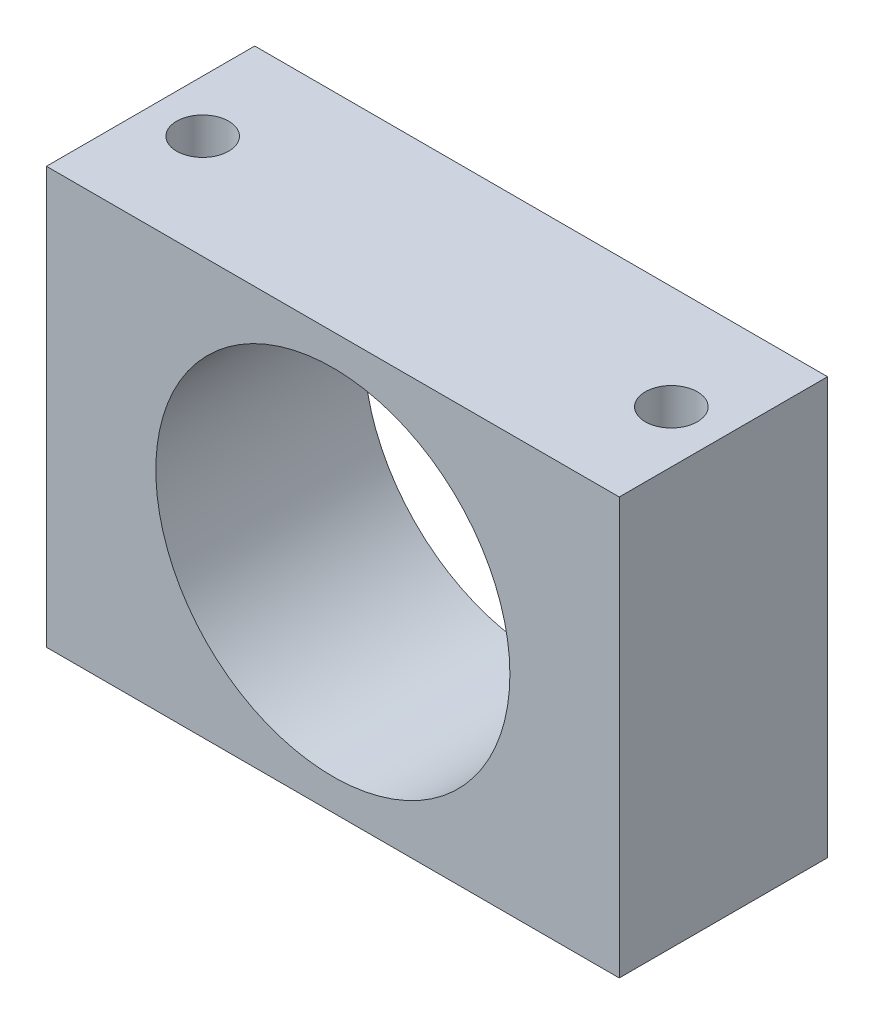
ISO-10303-21;
HEADER;
FILE_DESCRIPTION(('STEP AP214'),'2;1');
FILE_NAME('part.step','',(''),(''),'','','');
FILE_SCHEMA(('AUTOMOTIVE_DESIGN { 1 0 10303 214 1 1 1 1 }'));
ENDSEC;
DATA;
#1=APPLICATION_CONTEXT('core data for automotive mechanical design processes');
#2=APPLICATION_PROTOCOL_DEFINITION('international standard','automotive_design',2000,#1);
#3=PRODUCT_CONTEXT('',#1,'mechanical');
#4=PRODUCT('Part','Part','',(#3));
#5=PRODUCT_RELATED_PRODUCT_CATEGORY('part','',(#4));
#6=PRODUCT_DEFINITION_FORMATION('','',#4);
#7=PRODUCT_DEFINITION_CONTEXT('part definition',#1,'design');
#8=PRODUCT_DEFINITION('design','',#6,#7);
#9=PRODUCT_DEFINITION_SHAPE('','',#8);
#10=(LENGTH_UNIT() NAMED_UNIT(*) SI_UNIT(.MILLI.,.METRE.));
#11=(NAMED_UNIT(*) PLANE_ANGLE_UNIT() SI_UNIT($,.RADIAN.));
#12=(NAMED_UNIT(*) SI_UNIT($,.STERADIAN.) SOLID_ANGLE_UNIT());
#13=UNCERTAINTY_MEASURE_WITH_UNIT(LENGTH_MEASURE(1.E-05),#10,'distance_accuracy_value','');
#14=(GEOMETRIC_REPRESENTATION_CONTEXT(3) GLOBAL_UNCERTAINTY_ASSIGNED_CONTEXT((#13)) GLOBAL_UNIT_ASSIGNED_CONTEXT((#10,
#11,#12)) REPRESENTATION_CONTEXT('',''));
#15=CARTESIAN_POINT('',(0.,0.,0.));
#16=DIRECTION('',(0.,0.,1.));
#17=DIRECTION('',(1.,0.,0.));
#18=AXIS2_PLACEMENT_3D('',#15,#16,#17);
#19=CARTESIAN_POINT('',(0.,0.,20.));
#20=DIRECTION('',(0.,0.,1.));
#21=DIRECTION('',(1.,0.,0.));
#22=AXIS2_PLACEMENT_3D('',#19,#20,#21);
#23=PLANE('',#22);
#24=DIRECTION('',(0.,1.,0.));
#25=VECTOR('',#24,1.);
#26=CARTESIAN_POINT('',(27.5,20.,20.));
#27=LINE('',#26,#25);
#28=CARTESIAN_POINT('',(27.5,-20.,20.));
#29=VERTEX_POINT('',#28);
#30=CARTESIAN_POINT('',(27.5,20.,20.));
#31=VERTEX_POINT('',#30);
#32=EDGE_CURVE('E163',#29,#31,#27,.T.);
#33=ORIENTED_EDGE('',*,*,#32,.T.);
#34=DIRECTION('',(-1.,0.,0.));
#35=VECTOR('',#34,1.);
#36=CARTESIAN_POINT('',(-27.5,20.,20.));
#37=LINE('',#36,#35);
#38=CARTESIAN_POINT('',(-27.5,20.,20.));
#39=VERTEX_POINT('',#38);
#40=EDGE_CURVE('E100',#31,#39,#37,.T.);
#41=ORIENTED_EDGE('',*,*,#40,.T.);
#42=DIRECTION('',(0.,-1.,0.));
#43=VECTOR('',#42,1.);
#44=CARTESIAN_POINT('',(-27.5,20.,20.));
#45=LINE('',#44,#43);
#46=CARTESIAN_POINT('',(-27.5,-20.,20.));
#47=VERTEX_POINT('',#46);
#48=EDGE_CURVE('E166',#39,#47,#45,.T.);
#49=ORIENTED_EDGE('',*,*,#48,.T.);
#50=DIRECTION('',(1.,0.,0.));
#51=VECTOR('',#50,1.);
#52=CARTESIAN_POINT('',(-27.5,-20.,20.));
#53=LINE('',#52,#51);
#54=EDGE_CURVE('E69',#47,#29,#53,.T.);
#55=ORIENTED_EDGE('',*,*,#54,.T.);
#56=EDGE_LOOP('',(#33,#41,#49,#55));
#57=FACE_BOUND('',#56,.T.);
#58=CARTESIAN_POINT('',(0.,0.,20.));
#59=DIRECTION('',(0.,0.,1.));
#60=DIRECTION('',(1.,0.,0.));
#61=AXIS2_PLACEMENT_3D('',#58,#59,#60);
#62=CIRCLE('',#61,17.);
#63=CARTESIAN_POINT('',(17.,0.,20.));
#64=VERTEX_POINT('',#63);
#65=EDGE_CURVE('E157',#64,#64,#62,.T.);
#66=ORIENTED_EDGE('',*,*,#65,.F.);
#67=EDGE_LOOP('',(#66));
#68=FACE_BOUND('',#67,.T.);
#69=ADVANCED_FACE('F45',(#57,#68),#23,.T.);
#70=CARTESIAN_POINT('',(0.,0.,0.));
#71=DIRECTION('',(0.,0.,1.));
#72=DIRECTION('',(1.,0.,0.));
#73=AXIS2_PLACEMENT_3D('',#70,#71,#72);
#74=PLANE('',#73);
#75=CARTESIAN_POINT('',(19.0525588832577,-10.9999999999999,0.));
#76=DIRECTION('',(0.,0.,-1.));
#77=DIRECTION('',(-1.,0.,0.));
#78=AXIS2_PLACEMENT_3D('',#75,#76,#77);
#79=CIRCLE('',#78,1.65);
#80=CARTESIAN_POINT('',(17.4025588832577,-10.9999999999999,0.));
#81=VERTEX_POINT('',#80);
#82=EDGE_CURVE('E127',#81,#81,#79,.T.);
#83=ORIENTED_EDGE('',*,*,#82,.F.);
#84=EDGE_LOOP('',(#83));
#85=FACE_BOUND('',#84,.T.);
#86=CARTESIAN_POINT('',(19.0525588832576,11.0000000000002,0.));
#87=DIRECTION('',(0.,0.,-1.));
#88=DIRECTION('',(-1.,0.,0.));
#89=AXIS2_PLACEMENT_3D('',#86,#87,#88);
#90=CIRCLE('',#89,1.65);
#91=CARTESIAN_POINT('',(17.4025588832576,11.0000000000002,0.));
#92=VERTEX_POINT('',#91);
#93=EDGE_CURVE('E126',#92,#92,#90,.T.);
#94=ORIENTED_EDGE('',*,*,#93,.F.);
#95=EDGE_LOOP('',(#94));
#96=FACE_BOUND('',#95,.T.);
#97=CARTESIAN_POINT('',(-19.0525588832578,10.9999999999998,0.));
#98=DIRECTION('',(0.,0.,-1.));
#99=DIRECTION('',(-1.,0.,0.));
#100=AXIS2_PLACEMENT_3D('',#97,#98,#99);
#101=CIRCLE('',#100,1.65);
#102=CARTESIAN_POINT('',(-20.7025588832578,10.9999999999998,0.));
#103=VERTEX_POINT('',#102);
#104=EDGE_CURVE('E137',#103,#103,#101,.T.);
#105=ORIENTED_EDGE('',*,*,#104,.F.);
#106=EDGE_LOOP('',(#105));
#107=FACE_BOUND('',#106,.T.);
#108=DIRECTION('',(0.,1.,0.));
#109=VECTOR('',#108,1.);
#110=CARTESIAN_POINT('',(27.5,20.,0.));
#111=LINE('',#110,#109);
#112=CARTESIAN_POINT('',(27.5,-20.,0.));
#113=VERTEX_POINT('',#112);
#114=CARTESIAN_POINT('',(27.5,20.,0.));
#115=VERTEX_POINT('',#114);
#116=EDGE_CURVE('E160',#113,#115,#111,.T.);
#117=ORIENTED_EDGE('',*,*,#116,.F.);
#118=DIRECTION('',(1.,0.,0.));
#119=VECTOR('',#118,1.);
#120=CARTESIAN_POINT('',(-27.5,-20.,0.));
#121=LINE('',#120,#119);
#122=CARTESIAN_POINT('',(-27.5,-20.,0.));
#123=VERTEX_POINT('',#122);
#124=EDGE_CURVE('E93',#123,#113,#121,.T.);
#125=ORIENTED_EDGE('',*,*,#124,.F.);
#126=DIRECTION('',(0.,-1.,0.));
#127=VECTOR('',#126,1.);
#128=CARTESIAN_POINT('',(-27.5,20.,0.));
#129=LINE('',#128,#127);
#130=CARTESIAN_POINT('',(-27.5,20.,0.));
#131=VERTEX_POINT('',#130);
#132=EDGE_CURVE('E87',#131,#123,#129,.T.);
#133=ORIENTED_EDGE('',*,*,#132,.F.);
#134=DIRECTION('',(-1.,0.,0.));
#135=VECTOR('',#134,1.);
#136=CARTESIAN_POINT('',(-27.5,20.,0.));
#137=LINE('',#136,#135);
#138=EDGE_CURVE('E172',#115,#131,#137,.T.);
#139=ORIENTED_EDGE('',*,*,#138,.F.);
#140=EDGE_LOOP('',(#117,#125,#133,#139));
#141=FACE_BOUND('',#140,.T.);
#142=CARTESIAN_POINT('',(0.,0.,0.));
#143=DIRECTION('',(0.,0.,1.));
#144=DIRECTION('',(1.,0.,0.));
#145=AXIS2_PLACEMENT_3D('',#142,#143,#144);
#146=CIRCLE('',#145,17.);
#147=CARTESIAN_POINT('',(17.,0.,0.));
#148=VERTEX_POINT('',#147);
#149=EDGE_CURVE('E156',#148,#148,#146,.T.);
#150=ORIENTED_EDGE('',*,*,#149,.T.);
#151=EDGE_LOOP('',(#150));
#152=FACE_BOUND('',#151,.T.);
#153=ADVANCED_FACE('F213',(#85,#96,#107,#141,#152),#74,.F.);
#154=CARTESIAN_POINT('',(27.5,20.,20.));
#155=DIRECTION('',(-1.,0.,0.));
#156=DIRECTION('',(0.,0.,1.));
#157=AXIS2_PLACEMENT_3D('',#154,#155,#156);
#158=PLANE('',#157);
#159=ORIENTED_EDGE('',*,*,#116,.T.);
#160=DIRECTION('',(0.,0.,-1.));
#161=VECTOR('',#160,1.);
#162=CARTESIAN_POINT('',(27.5,20.,20.));
#163=LINE('',#162,#161);
#164=EDGE_CURVE('E11',#31,#115,#163,.T.);
#165=ORIENTED_EDGE('',*,*,#164,.F.);
#166=ORIENTED_EDGE('',*,*,#32,.F.);
#167=DIRECTION('',(0.,0.,-1.));
#168=VECTOR('',#167,1.);
#169=CARTESIAN_POINT('',(27.5,-20.,20.));
#170=LINE('',#169,#168);
#171=EDGE_CURVE('E169',#29,#113,#170,.T.);
#172=ORIENTED_EDGE('',*,*,#171,.T.);
#173=EDGE_LOOP('',(#159,#165,#166,#172));
#174=FACE_BOUND('',#173,.T.);
#175=ADVANCED_FACE('F47',(#174),#158,.F.);
#176=CARTESIAN_POINT('',(-27.5,20.,20.));
#177=DIRECTION('',(0.,-1.,0.));
#178=DIRECTION('',(0.,0.,-1.));
#179=AXIS2_PLACEMENT_3D('',#176,#177,#178);
#180=PLANE('',#179);
#181=CARTESIAN_POINT('',(22.5,20.,9.99999999999999));
#182=DIRECTION('',(0.,1.,0.));
#183=DIRECTION('',(0.,0.,1.));
#184=AXIS2_PLACEMENT_3D('',#181,#182,#183);
#185=CIRCLE('',#184,2.49999999999999);
#186=CARTESIAN_POINT('',(22.5,20.,12.5));
#187=VERTEX_POINT('',#186);
#188=EDGE_CURVE('E144',#187,#187,#185,.T.);
#189=ORIENTED_EDGE('',*,*,#188,.F.);
#190=EDGE_LOOP('',(#189));
#191=FACE_BOUND('',#190,.T.);
#192=CARTESIAN_POINT('',(-22.5,20.,10.));
#193=DIRECTION('',(0.,1.,0.));
#194=DIRECTION('',(0.,0.,1.));
#195=AXIS2_PLACEMENT_3D('',#192,#193,#194);
#196=CIRCLE('',#195,2.49999999999999);
#197=CARTESIAN_POINT('',(-22.5,20.,12.5));
#198=VERTEX_POINT('',#197);
#199=EDGE_CURVE('E150',#198,#198,#196,.T.);
#200=ORIENTED_EDGE('',*,*,#199,.F.);
#201=EDGE_LOOP('',(#200));
#202=FACE_BOUND('',#201,.T.);
#203=ORIENTED_EDGE('',*,*,#138,.T.);
#204=DIRECTION('',(0.,0.,-1.));
#205=VECTOR('',#204,1.);
#206=CARTESIAN_POINT('',(-27.5,20.,20.));
#207=LINE('',#206,#205);
#208=EDGE_CURVE('E60',#39,#131,#207,.T.);
#209=ORIENTED_EDGE('',*,*,#208,.F.);
#210=ORIENTED_EDGE('',*,*,#40,.F.);
#211=ORIENTED_EDGE('',*,*,#164,.T.);
#212=EDGE_LOOP('',(#203,#209,#210,#211));
#213=FACE_BOUND('',#212,.T.);
#214=ADVANCED_FACE('F229',(#191,#202,#213),#180,.F.);
#215=CARTESIAN_POINT('',(-27.5,20.,20.));
#216=DIRECTION('',(1.,0.,0.));
#217=DIRECTION('',(0.,0.,-1.));
#218=AXIS2_PLACEMENT_3D('',#215,#216,#217);
#219=PLANE('',#218);
#220=ORIENTED_EDGE('',*,*,#132,.T.);
#221=DIRECTION('',(0.,0.,-1.));
#222=VECTOR('',#221,1.);
#223=CARTESIAN_POINT('',(-27.5,-20.,20.));
#224=LINE('',#223,#222);
#225=EDGE_CURVE('E177',#47,#123,#224,.T.);
#226=ORIENTED_EDGE('',*,*,#225,.F.);
#227=ORIENTED_EDGE('',*,*,#48,.F.);
#228=ORIENTED_EDGE('',*,*,#208,.T.);
#229=EDGE_LOOP('',(#220,#226,#227,#228));
#230=FACE_BOUND('',#229,.T.);
#231=ADVANCED_FACE('F227',(#230),#219,.F.);
#232=CARTESIAN_POINT('',(-27.5,-20.,20.));
#233=DIRECTION('',(0.,1.,0.));
#234=DIRECTION('',(0.,0.,1.));
#235=AXIS2_PLACEMENT_3D('',#232,#233,#234);
#236=PLANE('',#235);
#237=ORIENTED_EDGE('',*,*,#124,.T.);
#238=ORIENTED_EDGE('',*,*,#171,.F.);
#239=ORIENTED_EDGE('',*,*,#54,.F.);
#240=ORIENTED_EDGE('',*,*,#225,.T.);
#241=EDGE_LOOP('',(#237,#238,#239,#240));
#242=FACE_BOUND('',#241,.T.);
#243=ADVANCED_FACE('F224',(#242),#236,.F.);
#244=CARTESIAN_POINT('',(0.,0.,20.));
#245=DIRECTION('',(0.,0.,-1.));
#246=DIRECTION('',(-1.,0.,0.));
#247=AXIS2_PLACEMENT_3D('',#244,#245,#246);
#248=CYLINDRICAL_SURFACE('',#247,17.);
#249=ORIENTED_EDGE('',*,*,#65,.T.);
#250=EDGE_LOOP('',(#249));
#251=FACE_BOUND('',#250,.T.);
#252=ORIENTED_EDGE('',*,*,#149,.F.);
#253=EDGE_LOOP('',(#252));
#254=FACE_BOUND('',#253,.T.);
#255=ADVANCED_FACE('F222',(#251,#254),#248,.F.);
#256=CARTESIAN_POINT('',(-22.5,3.,10.));
#257=DIRECTION('',(0.,1.,0.));
#258=DIRECTION('',(0.,0.,1.));
#259=AXIS2_PLACEMENT_3D('',#256,#257,#258);
#260=CONICAL_SURFACE('',#259,2.49999999999998,1.02974425867665);
#261=CARTESIAN_POINT('',(-22.5,1.4978484524311,10.));
#262=VERTEX_POINT('',#261);
#263=VERTEX_LOOP('',#262);
#264=FACE_BOUND('',#263,.T.);
#265=CARTESIAN_POINT('',(-22.5,3.,10.));
#266=DIRECTION('',(0.,1.,0.));
#267=DIRECTION('',(0.,0.,1.));
#268=AXIS2_PLACEMENT_3D('',#265,#266,#267);
#269=CIRCLE('',#268,2.49999999999998);
#270=CARTESIAN_POINT('',(-22.5,3.,12.5));
#271=VERTEX_POINT('',#270);
#272=EDGE_CURVE('E153',#271,#271,#269,.T.);
#273=ORIENTED_EDGE('',*,*,#272,.T.);
#274=EDGE_LOOP('',(#273));
#275=FACE_BOUND('',#274,.T.);
#276=ADVANCED_FACE('F209',(#264,#275),#260,.F.);
#277=CARTESIAN_POINT('',(-22.5,20.,10.));
#278=DIRECTION('',(0.,1.,0.));
#279=DIRECTION('',(0.,0.,1.));
#280=AXIS2_PLACEMENT_3D('',#277,#278,#279);
#281=CYLINDRICAL_SURFACE('',#280,2.49999999999999);
#282=CARTESIAN_POINT('',(-20.7025588832578,10.9999999999998,11.7375860933618));
#283=CARTESIAN_POINT('',(-20.7025597194879,10.933715134986,11.737586453714));
#284=CARTESIAN_POINT('',(-20.6985395599901,10.8674348598472,11.7334568496687));
#285=CARTESIAN_POINT('',(-20.6827686448469,10.7368680182177,11.7169155507055));
#286=CARTESIAN_POINT('',(-20.6710190774427,10.6725811468716,11.7045051287928));
#287=CARTESIAN_POINT('',(-20.6407156876032,10.5479270790977,11.6713946867485));
#288=CARTESIAN_POINT('',(-20.6221671667998,10.4875568716214,11.650701124422));
#289=CARTESIAN_POINT('',(-20.5797408549182,10.3723158920671,11.6011440941294));
#290=CARTESIAN_POINT('',(-20.555863444826,10.3174447272443,11.5722812101849));
#291=CARTESIAN_POINT('',(-20.5045912283946,10.2142283934768,11.5066768262348));
#292=CARTESIAN_POINT('',(-20.4771858714571,10.1659037301479,11.4699114629212));
#293=CARTESIAN_POINT('',(-20.4209811508093,10.0765764635405,11.3892783233937));
#294=CARTESIAN_POINT('',(-20.3921814485548,10.0355756499244,11.3454088161844));
#295=CARTESIAN_POINT('',(-20.3325155094463,9.9574803337346,11.247236147239));
#296=CARTESIAN_POINT('',(-20.3017017765801,9.92108821292055,11.1923452384297));
#297=CARTESIAN_POINT('',(-20.2427863035192,9.85641938218128,11.0766663401251));
#298=CARTESIAN_POINT('',(-20.2146862156506,9.82814759626659,11.0158748023682));
#299=CARTESIAN_POINT('',(-20.1581825181534,9.77448994180739,10.8788002885065));
#300=CARTESIAN_POINT('',(-20.1305745175815,9.75045904129827,10.8016609327743));
#301=CARTESIAN_POINT('',(-20.0827050804156,9.71071176180059,10.6430908865814));
#302=CARTESIAN_POINT('',(-20.0624485268754,9.69500090606856,10.5616573847907));
#303=CARTESIAN_POINT('',(-20.0269484636,9.66821016575672,10.3797534271171));
#304=CARTESIAN_POINT('',(-20.0134920939808,9.65866349113707,10.278706598576));
#305=CARTESIAN_POINT('',(-19.9990470860784,9.64843035470559,10.0751783792813));
#306=CARTESIAN_POINT('',(-19.9980705010046,9.64775245851092,9.97269569734812));
#307=CARTESIAN_POINT('',(-20.0062812186574,9.65355530989585,9.81394892801066));
#308=CARTESIAN_POINT('',(-20.0111612612613,9.657000415992,9.75730446073389));
#309=CARTESIAN_POINT('',(-20.0247236878091,9.66678246194495,9.64473085442981));
#310=CARTESIAN_POINT('',(-20.0334047773552,9.67311841739095,9.58880147855445));
#311=CARTESIAN_POINT('',(-20.0544340952584,9.68892460404304,9.47809988400362));
#312=CARTESIAN_POINT('',(-20.0667811818922,9.6983938595318,9.42332731073848));
#313=CARTESIAN_POINT('',(-20.0949084400907,9.72080932462871,9.31542224478975));
#314=CARTESIAN_POINT('',(-20.1106875959525,9.73375450582023,9.26228927217592));
#315=CARTESIAN_POINT('',(-20.1549631617856,9.77179830083189,9.12934570029987));
#316=CARTESIAN_POINT('',(-20.1856689395814,9.79965998425504,9.05101643963182));
#317=CARTESIAN_POINT('',(-20.2525866957724,9.86657316147121,8.90191531493791));
#318=CARTESIAN_POINT('',(-20.2887896546932,9.90560641673027,8.83113138894488));
#319=CARTESIAN_POINT('',(-20.3573316223951,9.98882976065349,8.7104361013979));
#320=CARTESIAN_POINT('',(-20.3893198697103,10.0311002982934,8.65900869233404));
#321=CARTESIAN_POINT('',(-20.4524129099506,10.1247364020623,8.56451625384266));
#322=CARTESIAN_POINT('',(-20.4835179926865,10.1760989436669,8.52144845348543));
#323=CARTESIAN_POINT('',(-20.5421902410863,10.287622646413,8.44457640870542));
#324=CARTESIAN_POINT('',(-20.5697385311687,10.3478273942829,8.41082058690279));
#325=CARTESIAN_POINT('',(-20.6183936828134,10.475303063402,8.35349339967926));
#326=CARTESIAN_POINT('',(-20.6395016551557,10.5425727634455,8.32992027772715));
#327=CARTESIAN_POINT('',(-20.6715995215825,10.6753054057333,8.29487147595486));
#328=CARTESIAN_POINT('',(-20.6833565467668,10.7403392899463,8.28246375987505));
#329=CARTESIAN_POINT('',(-20.6989581311601,10.8723876723433,8.26610857742748));
#330=CARTESIAN_POINT('',(-20.7028044264838,10.9394017326759,8.26215925474523));
#331=CARTESIAN_POINT('',(-20.7022974567472,11.0710762781254,8.26268496702361));
#332=CARTESIAN_POINT('',(-20.6982184321132,11.1357393438236,8.26687824024822));
#333=CARTESIAN_POINT('',(-20.6827025059609,11.2631510944055,8.28315556396421));
#334=CARTESIAN_POINT('',(-20.6712667841449,11.3259000845361,8.29523834931699));
#335=CARTESIAN_POINT('',(-20.6418962349517,11.4476926108641,8.32730209014214));
#336=CARTESIAN_POINT('',(-20.6239662433522,11.5067388659219,8.34727716983946));
#337=CARTESIAN_POINT('',(-20.5829653007404,11.6196497389129,8.39501939228944));
#338=CARTESIAN_POINT('',(-20.5598945035908,11.6735145118572,8.42278630184147));
#339=CARTESIAN_POINT('',(-20.5097002291779,11.7762712197525,8.48659641794389));
#340=CARTESIAN_POINT('',(-20.4824860710825,11.8249949650693,8.52283821269817));
#341=CARTESIAN_POINT('',(-20.4265337493279,11.9151582719616,8.6024650756695));
#342=CARTESIAN_POINT('',(-20.3977951388199,11.9565956822302,8.64585224627694));
#343=CARTESIAN_POINT('',(-20.3382223919683,12.0354848342029,8.74292668031299));
#344=CARTESIAN_POINT('',(-20.3074278234239,12.0722595464439,8.79718562480553));
#345=CARTESIAN_POINT('',(-20.248415136982,12.1377056208284,8.91164257484854));
#346=CARTESIAN_POINT('',(-20.2201985364362,12.1663722312074,8.97184403525734));
#347=CARTESIAN_POINT('',(-20.1633712267603,12.2208222634848,9.10755608173786));
#348=CARTESIAN_POINT('',(-20.1355234613523,12.2452672204255,9.18392116586632));
#349=CARTESIAN_POINT('',(-20.0870134640342,12.2858463890912,9.34100371767852));
#350=CARTESIAN_POINT('',(-20.0663560216005,12.3019750647677,9.42172404520983));
#351=CARTESIAN_POINT('',(-20.0298080234211,12.3297081538802,9.60222985745911));
#352=CARTESIAN_POINT('',(-20.015683722655,12.3397738736062,9.70261311586417));
#353=CARTESIAN_POINT('',(-19.9997450932738,12.3510831792867,9.90489465179671));
#354=CARTESIAN_POINT('',(-19.9979425408996,12.352318325666,10.0067942854022));
#355=CARTESIAN_POINT('',(-20.0072703879634,12.3457628510772,10.2217709122764));
#356=CARTESIAN_POINT('',(-20.0199459348205,12.3368942039474,10.3347537822782));
#357=CARTESIAN_POINT('',(-20.0601104068826,12.3068942947517,10.5563996603403));
#358=CARTESIAN_POINT('',(-20.0875894154517,12.2857712410172,10.66506550805));
#359=CARTESIAN_POINT('',(-20.1479275874985,12.2344473104257,10.8515915082114));
#360=CARTESIAN_POINT('',(-20.1783547283841,12.2071799346458,10.9310471032041));
#361=CARTESIAN_POINT('',(-20.2450048142428,12.1413845383839,11.0824975915128));
#362=CARTESIAN_POINT('',(-20.2812182794219,12.1028748523823,11.1545043757649));
#363=CARTESIAN_POINT('',(-20.3499471644642,12.0206091073005,11.2772527991313));
#364=CARTESIAN_POINT('',(-20.3820612222382,11.9788225060086,11.3295344744705));
#365=CARTESIAN_POINT('',(-20.4455992685806,11.886053125374,11.4257482736125));
#366=CARTESIAN_POINT('',(-20.4770235013893,11.8350736617583,11.4696833961964));
#367=CARTESIAN_POINT('',(-20.5365008162912,11.7241477340296,11.5482648853344));
#368=CARTESIAN_POINT('',(-20.5645352609164,11.6641554324911,11.5828610832001));
#369=CARTESIAN_POINT('',(-20.6142536886323,11.5369047080582,11.6417855802086));
#370=CARTESIAN_POINT('',(-20.6359386546197,11.4696474119912,11.6661154688295));
#371=CARTESIAN_POINT('',(-20.6693145261676,11.3360628691668,11.7026899947969));
#372=CARTESIAN_POINT('',(-20.681695821922,11.2701384691946,11.7157830317547));
#373=CARTESIAN_POINT('',(-20.6983169200834,11.1361408691529,11.7332301972194));
#374=CARTESIAN_POINT('',(-20.702558024532,11.0680680145044,11.7375857233157));
#375=CARTESIAN_POINT('',(-20.7025588832578,10.9999999999998,11.7375860933618));
#376=B_SPLINE_CURVE_WITH_KNOTS('',3,(#282,#283,#284,#285,#286,#287,#288,#289,#290,#291,#292,
#293,#294,#295,#296,#297,#298,#299,#300,#301,#302,#303,#304,#305,#306,#307,#308,#309,#310,#311,
#312,#313,#314,#315,#316,#317,#318,#319,#320,#321,#322,#323,#324,#325,#326,#327,#328,#329,#330,
#331,#332,#333,#334,#335,#336,#337,#338,#339,#340,#341,#342,#343,#344,#345,#346,#347,#348,#349,
#350,#351,#352,#353,#354,#355,#356,#357,#358,#359,#360,#361,#362,#363,#364,#365,#366,#367,#368,
#369,#370,#371,#372,#373,#374,#375),.UNSPECIFIED.,.T.,.F.,(4,2,2,2,2,2,2,2,2,2,2,2,2,2,2,2,2,2,
2,2,2,2,2,2,2,2,2,2,2,2,2,2,2,2,2,2,2,2,2,2,2,2,2,2,2,2,4),(0.,0.198598967148901,
0.397167410826823,0.595581344692122,0.793981097602356,0.992988597842917,1.19204466140727,
1.40934374082984,1.62677430927187,1.88198414342967,2.13736318676814,2.44331549961186,
2.74956328461671,2.92026476984005,3.09090817001737,3.26149848135048,3.43203837590758,
3.69680984168034,3.96115148758719,4.18178899634447,4.40235324581368,4.62404369799437,
4.84569589294816,5.04642103938695,5.24710212932761,5.44096254756141,5.63479188654983,
5.82847719162402,6.02215670053478,6.2209336092021,6.41976910901409,6.63619715264688,
6.85275177266305,7.10645996013202,7.36033682075473,7.66472714569981,7.96940834440376,
8.3099041624328,8.65017217010237,8.91718223900985,9.18375926517085,9.4055342065417,
9.62722931645189,9.85009268544098,10.0729215370068,10.2768957047425,10.4808372436396),.UNSPECIFIED.);
#377=CARTESIAN_POINT('',(-20.7025588832578,10.9999999999998,11.7375860933618));
#378=VERTEX_POINT('',#377);
#379=EDGE_CURVE('E143',#378,#378,#376,.T.);
#380=ORIENTED_EDGE('',*,*,#379,.T.);
#381=EDGE_LOOP('',(#380));
#382=FACE_BOUND('',#381,.T.);
#383=ORIENTED_EDGE('',*,*,#272,.F.);
#384=EDGE_LOOP('',(#383));
#385=FACE_BOUND('',#384,.T.);
#386=ORIENTED_EDGE('',*,*,#199,.T.);
#387=EDGE_LOOP('',(#386));
#388=FACE_BOUND('',#387,.T.);
#389=ADVANCED_FACE('F185',(#382,#385,#388),#281,.F.);
#390=CARTESIAN_POINT('',(22.5,3.,9.99999999999999));
#391=DIRECTION('',(0.,1.,0.));
#392=DIRECTION('',(0.,0.,1.));
#393=AXIS2_PLACEMENT_3D('',#390,#391,#392);
#394=CONICAL_SURFACE('',#393,2.49999999999998,1.02974425867665);
#395=CARTESIAN_POINT('',(22.5,1.4978484524311,9.99999999999999));
#396=VERTEX_POINT('',#395);
#397=VERTEX_LOOP('',#396);
#398=FACE_BOUND('',#397,.T.);
#399=CARTESIAN_POINT('',(22.5,3.,9.99999999999999));
#400=DIRECTION('',(0.,1.,0.));
#401=DIRECTION('',(0.,0.,1.));
#402=AXIS2_PLACEMENT_3D('',#399,#400,#401);
#403=CIRCLE('',#402,2.49999999999998);
#404=CARTESIAN_POINT('',(22.5,3.,12.5));
#405=VERTEX_POINT('',#404);
#406=EDGE_CURVE('E147',#405,#405,#403,.T.);
#407=ORIENTED_EDGE('',*,*,#406,.T.);
#408=EDGE_LOOP('',(#407));
#409=FACE_BOUND('',#408,.T.);
#410=ADVANCED_FACE('F202',(#398,#409),#394,.F.);
#411=CARTESIAN_POINT('',(22.5,20.,9.99999999999999));
#412=DIRECTION('',(0.,1.,0.));
#413=DIRECTION('',(0.,0.,1.));
#414=AXIS2_PLACEMENT_3D('',#411,#412,#413);
#415=CYLINDRICAL_SURFACE('',#414,2.49999999999999);
#416=CARTESIAN_POINT('',(20.,9.64912793710676,9.99999999999999));
#417=CARTESIAN_POINT('',(20.0000019474434,9.6491226355876,10.1096940291673));
#418=CARTESIAN_POINT('',(20.0072452278111,9.65412432551684,10.2194167574255));
#419=CARTESIAN_POINT('',(20.0359207148581,9.6749265396135,10.4361715812819));
#420=CARTESIAN_POINT('',(20.0573690377553,9.69073933008817,10.5432004772839));
#421=CARTESIAN_POINT('',(20.09921021485,9.72433267952255,10.6994064242545));
#422=CARTESIAN_POINT('',(20.1148575506239,9.73725366114286,10.7509653218863));
#423=CARTESIAN_POINT('',(20.1490558121158,9.76682935914885,10.851995493057));
#424=CARTESIAN_POINT('',(20.1676050320619,9.78348188454656,10.9014679714719));
#425=CARTESIAN_POINT('',(20.2071162353251,9.82091799001578,10.997688856822));
#426=CARTESIAN_POINT('',(20.2280728454628,9.84169244276571,11.0444429924639));
#427=CARTESIAN_POINT('',(20.2717874002375,9.88779914244691,11.1347178987924));
#428=CARTESIAN_POINT('',(20.294544297257,9.91312874942592,11.1782405217774));
#429=CARTESIAN_POINT('',(20.3489036460546,9.97807380376049,11.2754715835371));
#430=CARTESIAN_POINT('',(20.3809092603088,10.0196297749647,11.3276895730756));
#431=CARTESIAN_POINT('',(20.444256016809,10.1118570289114,11.4238109338149));
#432=CARTESIAN_POINT('',(20.4755975665439,10.1625225293824,11.4677195433125));
#433=CARTESIAN_POINT('',(20.534985051575,10.2727813253366,11.5463390343788));
#434=CARTESIAN_POINT('',(20.5630124411586,10.3324209738434,11.5809994057958));
#435=CARTESIAN_POINT('',(20.6128110141196,10.4589572594205,11.640129860694));
#436=CARTESIAN_POINT('',(20.6345829355578,10.5258530390814,11.6646011465027));
#437=CARTESIAN_POINT('',(20.6680630962196,10.6581467900905,11.7013428821223));
#438=CARTESIAN_POINT('',(20.680522105982,10.7230997078065,11.7145403691951));
#439=CARTESIAN_POINT('',(20.6975373063491,10.8551740953572,11.7324215366078));
#440=CARTESIAN_POINT('',(20.70209529086,10.9222950694143,11.737107149557));
#441=CARTESIAN_POINT('',(20.7029395992511,11.0541960653018,11.7379793270039));
#442=CARTESIAN_POINT('',(20.6995200737766,11.1189726524112,11.734468125276));
#443=CARTESIAN_POINT('',(20.6852675201091,11.2467674519979,11.7195497187112));
#444=CARTESIAN_POINT('',(20.6744356857118,11.3097859459256,11.7081437853636));
#445=CARTESIAN_POINT('',(20.6461840395317,11.4322027072607,11.6774375249805));
#446=CARTESIAN_POINT('',(20.6287750548231,11.4916067390764,11.6581501678336));
#447=CARTESIAN_POINT('',(20.5886849389382,11.6053553661689,11.6117720180328));
#448=CARTESIAN_POINT('',(20.5660040186067,11.659700163662,11.5846815374454));
#449=CARTESIAN_POINT('',(20.5164811798635,11.7634250073781,11.5222588173822));
#450=CARTESIAN_POINT('',(20.4895506818681,11.8126501723123,11.4867403503621));
#451=CARTESIAN_POINT('',(20.4339946967788,11.9038770807918,11.4085174507044));
#452=CARTESIAN_POINT('',(20.4053687390008,11.9458768056956,11.3658110164659));
#453=CARTESIAN_POINT('',(20.3459598453795,12.0258193079271,11.2702487336634));
#454=CARTESIAN_POINT('',(20.315200376241,12.0631138492023,11.2168387524186));
#455=CARTESIAN_POINT('',(20.2560743564776,12.1296172868967,11.1040215444485));
#456=CARTESIAN_POINT('',(20.2277091956294,12.1588215094252,11.0446108779734));
#457=CARTESIAN_POINT('',(20.1704693083861,12.2143437039122,10.9107315169481));
#458=CARTESIAN_POINT('',(20.1423137075897,12.2393466801225,10.8354121479499));
#459=CARTESIAN_POINT('',(20.0929717180887,12.2810472857556,10.6803368593472));
#460=CARTESIAN_POINT('',(20.071789964892,12.2977393947154,10.6005780298432));
#461=CARTESIAN_POINT('',(20.033863992541,12.3267373801389,10.4219911786516));
#462=CARTESIAN_POINT('',(20.0188551067657,12.3374978489195,10.3225402249879));
#463=CARTESIAN_POINT('',(20.0009414401063,12.3502530980418,10.1219523027286));
#464=CARTESIAN_POINT('',(19.9980480778823,12.352239609185,10.0208138337516));
#465=CARTESIAN_POINT('',(20.0049132967761,12.3474257904274,9.80668762268394));
#466=CARTESIAN_POINT('',(20.016269409402,12.3395163126062,9.69377017651825));
#467=CARTESIAN_POINT('',(20.0538277379218,12.3116826690162,9.47192897376207));
#468=CARTESIAN_POINT('',(20.0800216881257,12.2917651921269,9.36300302957059));
#469=CARTESIAN_POINT('',(20.1385970406831,12.242637971772,9.17450321121856));
#470=CARTESIAN_POINT('',(20.1686175032309,12.2161616243333,9.09348230030819));
#471=CARTESIAN_POINT('',(20.2348451172645,12.1518778489547,8.93881745934629));
#472=CARTESIAN_POINT('',(20.2710421670465,12.1140888477255,8.86516179067139));
#473=CARTESIAN_POINT('',(20.3399778432726,12.0331321853504,8.73962905410909));
#474=CARTESIAN_POINT('',(20.3722437267694,11.9920009332931,8.68618381323743));
#475=CARTESIAN_POINT('',(20.436350527701,11.9004088758182,8.58762509317363));
#476=CARTESIAN_POINT('',(20.4681916013142,11.8499516063827,8.54250846908178));
#477=CARTESIAN_POINT('',(20.5287346150441,11.7398420658314,8.46159425385761));
#478=CARTESIAN_POINT('',(20.5574182280061,11.6801405041841,8.42584955986196));
#479=CARTESIAN_POINT('',(20.6085604712136,11.5532006307197,8.36474540820818));
#480=CARTESIAN_POINT('',(20.6310204813504,11.4859639942226,8.33938364785965));
#481=CARTESIAN_POINT('',(20.6655994936283,11.353300456658,8.30130342306458));
#482=CARTESIAN_POINT('',(20.6785329296654,11.2883748439873,8.28756785845147));
#483=CARTESIAN_POINT('',(20.6964977496292,11.1562255890104,8.26865551922532));
#484=CARTESIAN_POINT('',(20.7015309253814,11.0890024713269,8.2634768038545));
#485=CARTESIAN_POINT('',(20.7032681924285,10.9569252380418,8.26168064032044));
#486=CARTESIAN_POINT('',(20.7002841493279,10.8920790843213,8.26474264063275));
#487=CARTESIAN_POINT('',(20.6868676761525,10.764042395861,8.27876664253567));
#488=CARTESIAN_POINT('',(20.6764364941489,10.7008515855405,8.28972732038452));
#489=CARTESIAN_POINT('',(20.6489288747978,10.578034418358,8.31954114363179));
#490=CARTESIAN_POINT('',(20.6318673761754,10.5184003936895,8.33837655370387));
#491=CARTESIAN_POINT('',(20.5923874218569,10.4041098483693,8.38385771790117));
#492=CARTESIAN_POINT('',(20.5699691860149,10.3494531235637,8.41050315149342));
#493=CARTESIAN_POINT('',(20.5208997579446,10.2450961238546,8.47201470890286));
#494=CARTESIAN_POINT('',(20.4941615239046,10.1955423861904,8.50705918961024));
#495=CARTESIAN_POINT('',(20.4388783823966,10.1036177077315,8.58436115505386));
#496=CARTESIAN_POINT('',(20.4103330174907,10.061248595641,8.62662047070702));
#497=CARTESIAN_POINT('',(20.3510446695223,9.98061459224279,8.72119187618636));
#498=CARTESIAN_POINT('',(20.3203152113089,9.9429790612353,8.77404635263262));
#499=CARTESIAN_POINT('',(20.2611273221203,9.87577916689965,8.88579341233079));
#500=CARTESIAN_POINT('',(20.2326703135342,9.84621983109124,8.9446897254607));
#501=CARTESIAN_POINT('',(20.1751724288401,9.78999126698498,9.07737891093853));
#502=CARTESIAN_POINT('',(20.1468226718419,9.76462189201587,9.15201961849861));
#503=CARTESIAN_POINT('',(20.0969570679935,9.72218791131351,9.30578426742782));
#504=CARTESIAN_POINT('',(20.0754445397603,9.70512733632846,9.38491036400216));
#505=CARTESIAN_POINT('',(20.038795374464,9.67696664925829,9.55236209697984));
#506=CARTESIAN_POINT('',(20.0242921017586,9.66643982307539,9.64092220613117));
#507=CARTESIAN_POINT('',(20.0048915206527,9.65252109152914,9.81964795555154));
#508=CARTESIAN_POINT('',(19.9999983988957,9.64913229578822,9.90981427831176));
#509=CARTESIAN_POINT('',(20.,9.64912793710676,9.99999999999999));
#510=B_SPLINE_CURVE_WITH_KNOTS('',3,(#416,#417,#418,#419,#420,#421,#422,#423,#424,#425,#426,
#427,#428,#429,#430,#431,#432,#433,#434,#435,#436,#437,#438,#439,#440,#441,#442,#443,#444,#445,
#446,#447,#448,#449,#450,#451,#452,#453,#454,#455,#456,#457,#458,#459,#460,#461,#462,#463,#464,
#465,#466,#467,#468,#469,#470,#471,#472,#473,#474,#475,#476,#477,#478,#479,#480,#481,#482,#483,
#484,#485,#486,#487,#488,#489,#490,#491,#492,#493,#494,#495,#496,#497,#498,#499,#500,#501,#502,
#503,#504,#505,#506,#507,#508,#509),.UNSPECIFIED.,.T.,.F.,(4,2,2,2,2,2,2,2,2,2,2,2,2,2,2,2,2,2,
2,2,2,2,2,2,2,2,2,2,2,2,2,2,2,2,2,2,2,2,2,2,2,2,2,2,2,2,4),(0.,0.328802439233995,
0.657978559162878,0.824007086380583,0.989938383664375,1.15550627385611,1.32097851615175,
1.54204381738483,1.76296928969927,1.98507775380296,2.20716000133823,2.40847193115985,
2.6097381476677,2.80370105232263,2.99763272546797,3.19124653635482,3.38485260522026,
3.58321786261098,3.78163844954948,3.99692385593732,4.21233337757744,4.46403075365684,
4.71589509648279,5.01814316268333,5.3206760281495,5.6603653954467,5.99986571837518,
6.2699348446309,6.53956643818879,6.76291933221503,6.98618771452399,7.21069038842764,
7.43514324591305,7.63696089137906,7.83873275679871,8.03277054193446,8.22677581577943,
8.42034648842909,8.61390921781224,8.81201749409662,9.01017611947703,9.2247254338852,
9.43940800484684,9.68982171937713,9.94035679339338,10.2105663534787,10.4808936037425),.UNSPECIFIED.);
#511=CARTESIAN_POINT('',(20.,9.64912793710676,9.99999999999999));
#512=VERTEX_POINT('',#511);
#513=EDGE_CURVE('E49',#512,#512,#510,.T.);
#514=ORIENTED_EDGE('',*,*,#513,.T.);
#515=EDGE_LOOP('',(#514));
#516=FACE_BOUND('',#515,.T.);
#517=ORIENTED_EDGE('',*,*,#406,.F.);
#518=EDGE_LOOP('',(#517));
#519=FACE_BOUND('',#518,.T.);
#520=ORIENTED_EDGE('',*,*,#188,.T.);
#521=EDGE_LOOP('',(#520));
#522=FACE_BOUND('',#521,.T.);
#523=ADVANCED_FACE('F195',(#516,#519,#522),#415,.F.);
#524=CARTESIAN_POINT('',(-19.0525588832578,10.9999999999998,0.));
#525=DIRECTION('',(0.,0.,-1.));
#526=DIRECTION('',(-1.,0.,0.));
#527=AXIS2_PLACEMENT_3D('',#524,#525,#526);
#528=CYLINDRICAL_SURFACE('',#527,1.65);
#529=ORIENTED_EDGE('',*,*,#104,.T.);
#530=EDGE_LOOP('',(#529));
#531=FACE_BOUND('',#530,.T.);
#532=CARTESIAN_POINT('',(-19.0525588832578,10.9999999999998,12.));
#533=DIRECTION('',(0.,0.,-1.));
#534=DIRECTION('',(-1.,0.,0.));
#535=AXIS2_PLACEMENT_3D('',#532,#533,#534);
#536=CIRCLE('',#535,1.65);
#537=CARTESIAN_POINT('',(-20.7025588832578,10.9999999999998,12.));
#538=VERTEX_POINT('',#537);
#539=EDGE_CURVE('E140',#538,#538,#536,.T.);
#540=ORIENTED_EDGE('',*,*,#539,.F.);
#541=EDGE_LOOP('',(#540));
#542=FACE_BOUND('',#541,.T.);
#543=ORIENTED_EDGE('',*,*,#379,.F.);
#544=EDGE_LOOP('',(#543));
#545=FACE_BOUND('',#544,.T.);
#546=ADVANCED_FACE('F189',(#531,#542,#545),#528,.F.);
#547=CARTESIAN_POINT('',(-19.0525588832578,10.9999999999998,12.));
#548=DIRECTION('',(0.,0.,-1.));
#549=DIRECTION('',(-1.,0.,0.));
#550=AXIS2_PLACEMENT_3D('',#547,#548,#549);
#551=CONICAL_SURFACE('',#550,1.65,1.02974425867665);
#552=CARTESIAN_POINT('',(-19.0525588832578,10.9999999999998,12.9914200213955));
#553=VERTEX_POINT('',#552);
#554=VERTEX_LOOP('',#553);
#555=FACE_BOUND('',#554,.T.);
#556=ORIENTED_EDGE('',*,*,#539,.T.);
#557=EDGE_LOOP('',(#556));
#558=FACE_BOUND('',#557,.T.);
#559=ADVANCED_FACE('F194',(#555,#558),#551,.F.);
#560=CARTESIAN_POINT('',(19.0525588832576,11.0000000000002,0.));
#561=DIRECTION('',(0.,0.,-1.));
#562=DIRECTION('',(-1.,0.,0.));
#563=AXIS2_PLACEMENT_3D('',#560,#561,#562);
#564=CYLINDRICAL_SURFACE('',#563,1.65);
#565=ORIENTED_EDGE('',*,*,#93,.T.);
#566=EDGE_LOOP('',(#565));
#567=FACE_BOUND('',#566,.T.);
#568=CARTESIAN_POINT('',(19.0525588832576,11.0000000000002,12.));
#569=DIRECTION('',(0.,0.,-1.));
#570=DIRECTION('',(-1.,0.,0.));
#571=AXIS2_PLACEMENT_3D('',#568,#569,#570);
#572=CIRCLE('',#571,1.65);
#573=CARTESIAN_POINT('',(17.4025588832576,11.0000000000002,12.));
#574=VERTEX_POINT('',#573);
#575=EDGE_CURVE('E130',#574,#574,#572,.T.);
#576=ORIENTED_EDGE('',*,*,#575,.F.);
#577=EDGE_LOOP('',(#576));
#578=FACE_BOUND('',#577,.T.);
#579=ORIENTED_EDGE('',*,*,#513,.F.);
#580=EDGE_LOOP('',(#579));
#581=FACE_BOUND('',#580,.T.);
#582=ADVANCED_FACE('F198',(#567,#578,#581),#564,.F.);
#583=CARTESIAN_POINT('',(19.0525588832576,11.0000000000002,12.));
#584=DIRECTION('',(0.,0.,-1.));
#585=DIRECTION('',(-1.,0.,0.));
#586=AXIS2_PLACEMENT_3D('',#583,#584,#585);
#587=CONICAL_SURFACE('',#586,1.65,1.02974425867665);
#588=CARTESIAN_POINT('',(19.0525588832576,11.0000000000002,12.9914200213955));
#589=VERTEX_POINT('',#588);
#590=VERTEX_LOOP('',#589);
#591=FACE_BOUND('',#590,.T.);
#592=ORIENTED_EDGE('',*,*,#575,.T.);
#593=EDGE_LOOP('',(#592));
#594=FACE_BOUND('',#593,.T.);
#595=ADVANCED_FACE('F120',(#591,#594),#587,.F.);
#596=CARTESIAN_POINT('',(19.0525588832577,-10.9999999999999,12.));
#597=DIRECTION('',(0.,0.,-1.));
#598=DIRECTION('',(-1.,0.,0.));
#599=AXIS2_PLACEMENT_3D('',#596,#597,#598);
#600=CONICAL_SURFACE('',#599,1.65,1.02974425867665);
#601=CARTESIAN_POINT('',(19.0525588832577,-10.9999999999999,12.9914200213955));
#602=VERTEX_POINT('',#601);
#603=VERTEX_LOOP('',#602);
#604=FACE_BOUND('',#603,.T.);
#605=CARTESIAN_POINT('',(19.0525588832577,-10.9999999999999,12.));
#606=DIRECTION('',(0.,0.,-1.));
#607=DIRECTION('',(-1.,0.,0.));
#608=AXIS2_PLACEMENT_3D('',#605,#606,#607);
#609=CIRCLE('',#608,1.65);
#610=CARTESIAN_POINT('',(17.4025588832577,-10.9999999999999,12.));
#611=VERTEX_POINT('',#610);
#612=EDGE_CURVE('E124',#611,#611,#609,.T.);
#613=ORIENTED_EDGE('',*,*,#612,.T.);
#614=EDGE_LOOP('',(#613));
#615=FACE_BOUND('',#614,.T.);
#616=ADVANCED_FACE('F116',(#604,#615),#600,.F.);
#617=CARTESIAN_POINT('',(19.0525588832577,-10.9999999999999,0.));
#618=DIRECTION('',(0.,0.,-1.));
#619=DIRECTION('',(-1.,0.,0.));
#620=AXIS2_PLACEMENT_3D('',#617,#618,#619);
#621=CYLINDRICAL_SURFACE('',#620,1.65);
#622=ORIENTED_EDGE('',*,*,#612,.F.);
#623=EDGE_LOOP('',(#622));
#624=FACE_BOUND('',#623,.T.);
#625=ORIENTED_EDGE('',*,*,#82,.T.);
#626=EDGE_LOOP('',(#625));
#627=FACE_BOUND('',#626,.T.);
#628=ADVANCED_FACE('F119',(#624,#627),#621,.F.);
#629=CLOSED_SHELL('',(#69,#153,#175,#214,#231,#243,#255,#276,#389,#410,#523,#546,#559,#582,#595,
#616,#628));
#630=MANIFOLD_SOLID_BREP('B2',#629);
#631=ADVANCED_BREP_SHAPE_REPRESENTATION('',(#18,#630),#14);
#632=SHAPE_DEFINITION_REPRESENTATION(#9,#631);
ENDSEC;
END-ISO-10303-21;
